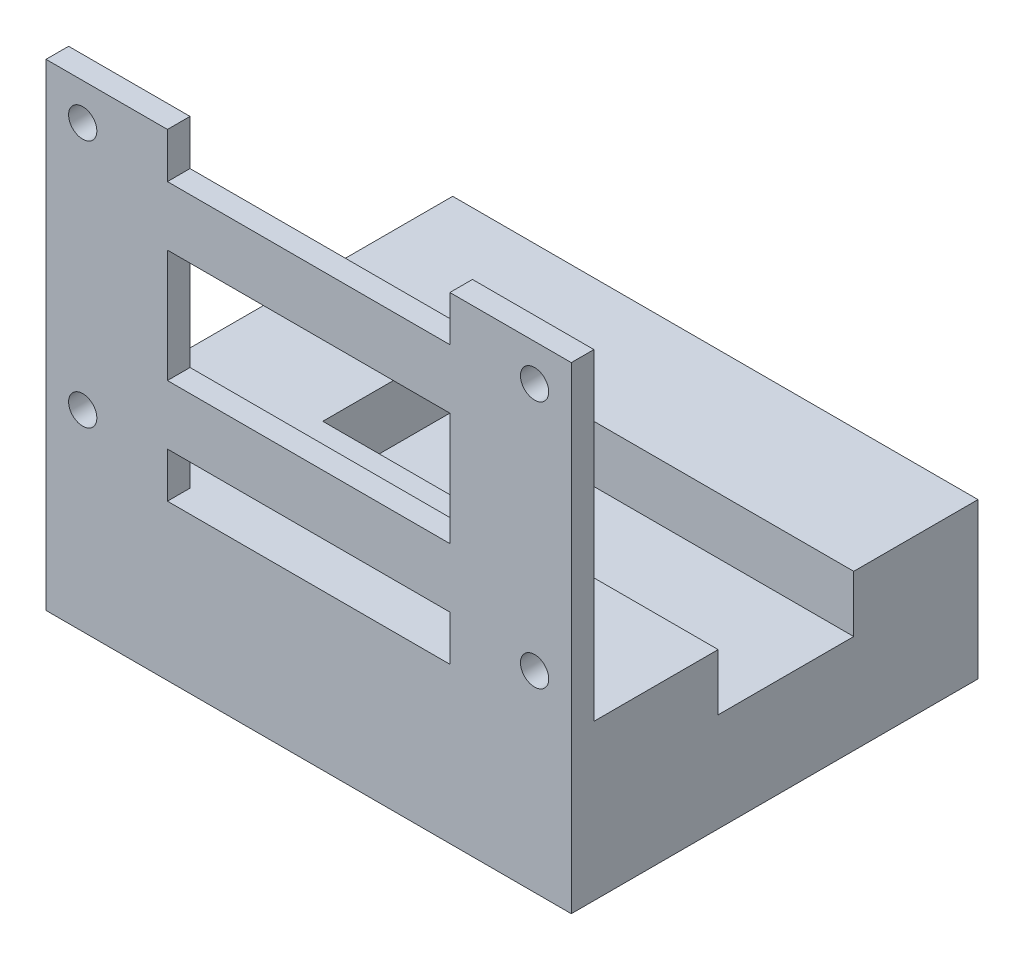
ISO-10303-21;
HEADER;
FILE_DESCRIPTION(('STEP AP214'),'2;1');
FILE_NAME('part.step','',(''),(''),'','','');
FILE_SCHEMA(('AUTOMOTIVE_DESIGN { 1 0 10303 214 1 1 1 1 }'));
ENDSEC;
DATA;
#1=APPLICATION_CONTEXT('core data for automotive mechanical design processes');
#2=APPLICATION_PROTOCOL_DEFINITION('international standard','automotive_design',2000,#1);
#3=PRODUCT_CONTEXT('',#1,'mechanical');
#4=PRODUCT('Part','Part','',(#3));
#5=PRODUCT_RELATED_PRODUCT_CATEGORY('part','',(#4));
#6=PRODUCT_DEFINITION_FORMATION('','',#4);
#7=PRODUCT_DEFINITION_CONTEXT('part definition',#1,'design');
#8=PRODUCT_DEFINITION('design','',#6,#7);
#9=PRODUCT_DEFINITION_SHAPE('','',#8);
#10=(LENGTH_UNIT() NAMED_UNIT(*) SI_UNIT(.MILLI.,.METRE.));
#11=(NAMED_UNIT(*) PLANE_ANGLE_UNIT() SI_UNIT($,.RADIAN.));
#12=(NAMED_UNIT(*) SI_UNIT($,.STERADIAN.) SOLID_ANGLE_UNIT());
#13=UNCERTAINTY_MEASURE_WITH_UNIT(LENGTH_MEASURE(1.E-05),#10,'distance_accuracy_value','');
#14=(GEOMETRIC_REPRESENTATION_CONTEXT(3) GLOBAL_UNCERTAINTY_ASSIGNED_CONTEXT((#13)) GLOBAL_UNIT_ASSIGNED_CONTEXT((#10,
#11,#12)) REPRESENTATION_CONTEXT('',''));
#15=CARTESIAN_POINT('',(0.,0.,0.));
#16=DIRECTION('',(0.,0.,1.));
#17=DIRECTION('',(1.,0.,0.));
#18=AXIS2_PLACEMENT_3D('',#15,#16,#17);
#19=CARTESIAN_POINT('',(-23.25,42.25,19.));
#20=DIRECTION('',(0.,-1.,0.));
#21=DIRECTION('',(0.,0.,-1.));
#22=AXIS2_PLACEMENT_3D('',#19,#20,#21);
#23=PLANE('',#22);
#24=DIRECTION('',(-1.,0.,0.));
#25=VECTOR('',#24,1.);
#26=CARTESIAN_POINT('',(-23.25,42.25,17.));
#27=LINE('',#26,#25);
#28=CARTESIAN_POINT('',(23.25,42.25,17.));
#29=VERTEX_POINT('',#28);
#30=CARTESIAN_POINT('',(12.5,42.25,17.));
#31=VERTEX_POINT('',#30);
#32=EDGE_CURVE('E454',#29,#31,#27,.T.);
#33=ORIENTED_EDGE('',*,*,#32,.T.);
#34=DIRECTION('',(0.,0.,-1.));
#35=VECTOR('',#34,1.);
#36=CARTESIAN_POINT('',(12.5,42.25,27.));
#37=LINE('',#36,#35);
#38=CARTESIAN_POINT('',(12.5,42.25,19.));
#39=VERTEX_POINT('',#38);
#40=EDGE_CURVE('E289',#39,#31,#37,.T.);
#41=ORIENTED_EDGE('',*,*,#40,.F.);
#42=DIRECTION('',(-1.,0.,0.));
#43=VECTOR('',#42,1.);
#44=CARTESIAN_POINT('',(-23.25,42.25,19.));
#45=LINE('',#44,#43);
#46=CARTESIAN_POINT('',(23.25,42.25,19.));
#47=VERTEX_POINT('',#46);
#48=EDGE_CURVE('E462',#47,#39,#45,.T.);
#49=ORIENTED_EDGE('',*,*,#48,.F.);
#50=DIRECTION('',(0.,0.,-1.));
#51=VECTOR('',#50,1.);
#52=CARTESIAN_POINT('',(23.25,42.25,19.));
#53=LINE('',#52,#51);
#54=EDGE_CURVE('E233',#47,#29,#53,.T.);
#55=ORIENTED_EDGE('',*,*,#54,.T.);
#56=EDGE_LOOP('',(#33,#41,#49,#55));
#57=FACE_BOUND('',#56,.T.);
#58=ADVANCED_FACE('F39',(#57),#23,.F.);
#59=CARTESIAN_POINT('',(23.25,13.75,17.));
#60=DIRECTION('',(-1.,0.,0.));
#61=DIRECTION('',(0.,0.,1.));
#62=AXIS2_PLACEMENT_3D('',#59,#60,#61);
#63=PLANE('',#62);
#64=DIRECTION('',(0.,0.,-1.));
#65=VECTOR('',#64,1.);
#66=CARTESIAN_POINT('',(23.25,8.75,-6.));
#67=LINE('',#66,#65);
#68=CARTESIAN_POINT('',(23.25,8.75,6.));
#69=VERTEX_POINT('',#68);
#70=CARTESIAN_POINT('',(23.25,8.75,-6.));
#71=VERTEX_POINT('',#70);
#72=EDGE_CURVE('E333',#69,#71,#67,.T.);
#73=ORIENTED_EDGE('',*,*,#72,.F.);
#74=DIRECTION('',(0.,1.,0.));
#75=VECTOR('',#74,1.);
#76=CARTESIAN_POINT('',(23.25,8.75,6.));
#77=LINE('',#76,#75);
#78=CARTESIAN_POINT('',(23.25,13.75,6.));
#79=VERTEX_POINT('',#78);
#80=EDGE_CURVE('E360',#69,#79,#77,.T.);
#81=ORIENTED_EDGE('',*,*,#80,.T.);
#82=DIRECTION('',(0.,0.,-1.));
#83=VECTOR('',#82,1.);
#84=CARTESIAN_POINT('',(23.25,13.75,17.));
#85=LINE('',#84,#83);
#86=CARTESIAN_POINT('',(23.25,13.75,17.));
#87=VERTEX_POINT('',#86);
#88=EDGE_CURVE('E482',#87,#79,#85,.T.);
#89=ORIENTED_EDGE('',*,*,#88,.F.);
#90=DIRECTION('',(0.,1.,0.));
#91=VECTOR('',#90,1.);
#92=CARTESIAN_POINT('',(23.25,0.,17.));
#93=LINE('',#92,#91);
#94=EDGE_CURVE('E469',#87,#29,#93,.T.);
#95=ORIENTED_EDGE('',*,*,#94,.T.);
#96=ORIENTED_EDGE('',*,*,#54,.F.);
#97=DIRECTION('',(0.,1.,0.));
#98=VECTOR('',#97,1.);
#99=CARTESIAN_POINT('',(23.25,0.,19.));
#100=LINE('',#99,#98);
#101=CARTESIAN_POINT('',(23.25,0.,19.));
#102=VERTEX_POINT('',#101);
#103=EDGE_CURVE('E458',#102,#47,#100,.T.);
#104=ORIENTED_EDGE('',*,*,#103,.F.);
#105=DIRECTION('',(0.,0.,-1.));
#106=VECTOR('',#105,1.);
#107=CARTESIAN_POINT('',(23.25,0.,17.));
#108=LINE('',#107,#106);
#109=CARTESIAN_POINT('',(23.25,0.,-17.));
#110=VERTEX_POINT('',#109);
#111=EDGE_CURVE('E228',#102,#110,#108,.T.);
#112=ORIENTED_EDGE('',*,*,#111,.T.);
#113=DIRECTION('',(0.,-1.,0.));
#114=VECTOR('',#113,1.);
#115=CARTESIAN_POINT('',(23.25,13.75,-17.));
#116=LINE('',#115,#114);
#117=CARTESIAN_POINT('',(23.25,13.75,-17.));
#118=VERTEX_POINT('',#117);
#119=EDGE_CURVE('E223',#118,#110,#116,.T.);
#120=ORIENTED_EDGE('',*,*,#119,.F.);
#121=CARTESIAN_POINT('',(23.25,13.75,-6.));
#122=VERTEX_POINT('',#121);
#123=EDGE_CURVE('E238',#122,#118,#85,.T.);
#124=ORIENTED_EDGE('',*,*,#123,.F.);
#125=DIRECTION('',(0.,1.,0.));
#126=VECTOR('',#125,1.);
#127=CARTESIAN_POINT('',(23.25,8.75,-6.));
#128=LINE('',#127,#126);
#129=EDGE_CURVE('E350',#71,#122,#128,.T.);
#130=ORIENTED_EDGE('',*,*,#129,.F.);
#131=EDGE_LOOP('',(#73,#81,#89,#95,#96,#104,#112,#120,#124,#130));
#132=FACE_BOUND('',#131,.T.);
#133=ADVANCED_FACE('F41',(#132),#63,.F.);
#134=CARTESIAN_POINT('',(-23.25,13.75,-17.));
#135=DIRECTION('',(0.,0.,1.));
#136=DIRECTION('',(1.,0.,0.));
#137=AXIS2_PLACEMENT_3D('',#134,#135,#136);
#138=PLANE('',#137);
#139=DIRECTION('',(-1.,0.,0.));
#140=VECTOR('',#139,1.);
#141=CARTESIAN_POINT('',(-23.25,0.,-17.));
#142=LINE('',#141,#140);
#143=CARTESIAN_POINT('',(-23.25,0.,-17.));
#144=VERTEX_POINT('',#143);
#145=EDGE_CURVE('E232',#110,#144,#142,.T.);
#146=ORIENTED_EDGE('',*,*,#145,.T.);
#147=DIRECTION('',(0.,-1.,0.));
#148=VECTOR('',#147,1.);
#149=CARTESIAN_POINT('',(-23.25,13.75,-17.));
#150=LINE('',#149,#148);
#151=CARTESIAN_POINT('',(-23.25,13.75,-17.));
#152=VERTEX_POINT('',#151);
#153=EDGE_CURVE('E217',#152,#144,#150,.T.);
#154=ORIENTED_EDGE('',*,*,#153,.F.);
#155=DIRECTION('',(-1.,0.,0.));
#156=VECTOR('',#155,1.);
#157=CARTESIAN_POINT('',(-23.25,13.75,-17.));
#158=LINE('',#157,#156);
#159=EDGE_CURVE('E484',#118,#152,#158,.T.);
#160=ORIENTED_EDGE('',*,*,#159,.F.);
#161=ORIENTED_EDGE('',*,*,#119,.T.);
#162=EDGE_LOOP('',(#146,#154,#160,#161));
#163=FACE_BOUND('',#162,.T.);
#164=ADVANCED_FACE('F493',(#163),#138,.F.);
#165=CARTESIAN_POINT('',(-23.25,13.75,17.));
#166=DIRECTION('',(1.,0.,0.));
#167=DIRECTION('',(0.,0.,-1.));
#168=AXIS2_PLACEMENT_3D('',#165,#166,#167);
#169=PLANE('',#168);
#170=DIRECTION('',(0.,0.,1.));
#171=VECTOR('',#170,1.);
#172=CARTESIAN_POINT('',(-23.25,0.,17.));
#173=LINE('',#172,#171);
#174=CARTESIAN_POINT('',(-23.25,0.,19.));
#175=VERTEX_POINT('',#174);
#176=EDGE_CURVE('E236',#144,#175,#173,.T.);
#177=ORIENTED_EDGE('',*,*,#176,.T.);
#178=DIRECTION('',(0.,-1.,0.));
#179=VECTOR('',#178,1.);
#180=CARTESIAN_POINT('',(-23.25,0.,19.));
#181=LINE('',#180,#179);
#182=CARTESIAN_POINT('',(-23.25,42.25,19.));
#183=VERTEX_POINT('',#182);
#184=EDGE_CURVE('E449',#183,#175,#181,.T.);
#185=ORIENTED_EDGE('',*,*,#184,.F.);
#186=DIRECTION('',(0.,0.,-1.));
#187=VECTOR('',#186,1.);
#188=CARTESIAN_POINT('',(-23.25,42.25,19.));
#189=LINE('',#188,#187);
#190=CARTESIAN_POINT('',(-23.25,42.25,17.));
#191=VERTEX_POINT('',#190);
#192=EDGE_CURVE('E466',#183,#191,#189,.T.);
#193=ORIENTED_EDGE('',*,*,#192,.T.);
#194=DIRECTION('',(0.,-1.,0.));
#195=VECTOR('',#194,1.);
#196=CARTESIAN_POINT('',(-23.25,0.,17.));
#197=LINE('',#196,#195);
#198=CARTESIAN_POINT('',(-23.25,13.75,17.));
#199=VERTEX_POINT('',#198);
#200=EDGE_CURVE('E445',#191,#199,#197,.T.);
#201=ORIENTED_EDGE('',*,*,#200,.T.);
#202=DIRECTION('',(0.,0.,1.));
#203=VECTOR('',#202,1.);
#204=CARTESIAN_POINT('',(-23.25,13.75,17.));
#205=LINE('',#204,#203);
#206=EDGE_CURVE('E215',#152,#199,#205,.T.);
#207=ORIENTED_EDGE('',*,*,#206,.F.);
#208=ORIENTED_EDGE('',*,*,#153,.T.);
#209=EDGE_LOOP('',(#177,#185,#193,#201,#207,#208));
#210=FACE_BOUND('',#209,.T.);
#211=ADVANCED_FACE('F496',(#210),#169,.F.);
#212=CARTESIAN_POINT('',(0.,13.75,0.));
#213=DIRECTION('',(0.,-1.,0.));
#214=DIRECTION('',(0.,0.,-1.));
#215=AXIS2_PLACEMENT_3D('',#212,#213,#214);
#216=PLANE('',#215);
#217=ORIENTED_EDGE('',*,*,#88,.T.);
#218=DIRECTION('',(1.,0.,0.));
#219=VECTOR('',#218,1.);
#220=CARTESIAN_POINT('',(23.25,13.75,6.));
#221=LINE('',#220,#219);
#222=CARTESIAN_POINT('',(-11.75,13.75,6.00000000000001));
#223=VERTEX_POINT('',#222);
#224=EDGE_CURVE('E338',#223,#79,#221,.T.);
#225=ORIENTED_EDGE('',*,*,#224,.F.);
#226=DIRECTION('',(0.,0.,1.));
#227=VECTOR('',#226,1.);
#228=CARTESIAN_POINT('',(-11.75,13.75,-5.99999999999999));
#229=LINE('',#228,#227);
#230=CARTESIAN_POINT('',(-11.75,13.75,-5.99999999999999));
#231=VERTEX_POINT('',#230);
#232=EDGE_CURVE('E354',#231,#223,#229,.T.);
#233=ORIENTED_EDGE('',*,*,#232,.F.);
#234=DIRECTION('',(-1.,0.,0.));
#235=VECTOR('',#234,1.);
#236=CARTESIAN_POINT('',(23.25,13.75,-6.));
#237=LINE('',#236,#235);
#238=EDGE_CURVE('E329',#122,#231,#237,.T.);
#239=ORIENTED_EDGE('',*,*,#238,.F.);
#240=ORIENTED_EDGE('',*,*,#123,.T.);
#241=ORIENTED_EDGE('',*,*,#159,.T.);
#242=ORIENTED_EDGE('',*,*,#206,.T.);
#243=DIRECTION('',(1.,0.,0.));
#244=VECTOR('',#243,1.);
#245=CARTESIAN_POINT('',(-23.25,13.75,17.));
#246=LINE('',#245,#244);
#247=CARTESIAN_POINT('',(-12.5,13.75,17.));
#248=VERTEX_POINT('',#247);
#249=EDGE_CURVE('E205',#199,#248,#246,.T.);
#250=ORIENTED_EDGE('',*,*,#249,.T.);
#251=DIRECTION('',(0.,0.,-1.));
#252=VECTOR('',#251,1.);
#253=CARTESIAN_POINT('',(-12.5,13.75,27.));
#254=LINE('',#253,#252);
#255=CARTESIAN_POINT('',(-12.5,13.75,19.));
#256=VERTEX_POINT('',#255);
#257=EDGE_CURVE('E63',#256,#248,#254,.T.);
#258=ORIENTED_EDGE('',*,*,#257,.F.);
#259=DIRECTION('',(-1.,0.,0.));
#260=VECTOR('',#259,1.);
#261=CARTESIAN_POINT('',(0.,13.75,19.));
#262=LINE('',#261,#260);
#263=CARTESIAN_POINT('',(12.5,13.75,19.));
#264=VERTEX_POINT('',#263);
#265=EDGE_CURVE('E255',#264,#256,#262,.T.);
#266=ORIENTED_EDGE('',*,*,#265,.F.);
#267=DIRECTION('',(0.,0.,-1.));
#268=VECTOR('',#267,1.);
#269=CARTESIAN_POINT('',(12.5,13.75,27.));
#270=LINE('',#269,#268);
#271=CARTESIAN_POINT('',(12.5,13.75,17.));
#272=VERTEX_POINT('',#271);
#273=EDGE_CURVE('E199',#264,#272,#270,.T.);
#274=ORIENTED_EDGE('',*,*,#273,.T.);
#275=EDGE_CURVE('E218',#272,#87,#246,.T.);
#276=ORIENTED_EDGE('',*,*,#275,.T.);
#277=EDGE_LOOP('',(#217,#225,#233,#239,#240,#241,#242,#250,#258,#266,#274,#276));
#278=FACE_BOUND('',#277,.T.);
#279=ADVANCED_FACE('F213',(#278),#216,.F.);
#280=CARTESIAN_POINT('',(0.,0.,0.));
#281=DIRECTION('',(0.,-1.,0.));
#282=DIRECTION('',(0.,0.,-1.));
#283=AXIS2_PLACEMENT_3D('',#280,#281,#282);
#284=PLANE('',#283);
#285=CARTESIAN_POINT('',(16.25,0.,12.));
#286=DIRECTION('',(0.,-1.,0.));
#287=DIRECTION('',(0.,0.,-1.));
#288=AXIS2_PLACEMENT_3D('',#285,#286,#287);
#289=CIRCLE('',#288,2.);
#290=CARTESIAN_POINT('',(16.25,0.,10.));
#291=VERTEX_POINT('',#290);
#292=EDGE_CURVE('E309',#291,#291,#289,.T.);
#293=ORIENTED_EDGE('',*,*,#292,.F.);
#294=EDGE_LOOP('',(#293));
#295=FACE_BOUND('',#294,.T.);
#296=CARTESIAN_POINT('',(-16.25,0.,-10.));
#297=DIRECTION('',(0.,-1.,0.));
#298=DIRECTION('',(0.,0.,-1.));
#299=AXIS2_PLACEMENT_3D('',#296,#297,#298);
#300=CIRCLE('',#299,2.);
#301=CARTESIAN_POINT('',(-16.25,0.,-12.));
#302=VERTEX_POINT('',#301);
#303=EDGE_CURVE('E318',#302,#302,#300,.T.);
#304=ORIENTED_EDGE('',*,*,#303,.F.);
#305=EDGE_LOOP('',(#304));
#306=FACE_BOUND('',#305,.T.);
#307=CARTESIAN_POINT('',(-16.25,0.,12.));
#308=DIRECTION('',(0.,-1.,0.));
#309=DIRECTION('',(0.,0.,-1.));
#310=AXIS2_PLACEMENT_3D('',#307,#308,#309);
#311=CIRCLE('',#310,2.);
#312=CARTESIAN_POINT('',(-16.25,0.,10.));
#313=VERTEX_POINT('',#312);
#314=EDGE_CURVE('E301',#313,#313,#311,.T.);
#315=ORIENTED_EDGE('',*,*,#314,.F.);
#316=EDGE_LOOP('',(#315));
#317=FACE_BOUND('',#316,.T.);
#318=CARTESIAN_POINT('',(16.25,0.,-10.));
#319=DIRECTION('',(0.,-1.,0.));
#320=DIRECTION('',(0.,0.,-1.));
#321=AXIS2_PLACEMENT_3D('',#318,#319,#320);
#322=CIRCLE('',#321,2.);
#323=CARTESIAN_POINT('',(16.25,0.,-12.));
#324=VERTEX_POINT('',#323);
#325=EDGE_CURVE('E313',#324,#324,#322,.T.);
#326=ORIENTED_EDGE('',*,*,#325,.F.);
#327=EDGE_LOOP('',(#326));
#328=FACE_BOUND('',#327,.T.);
#329=ORIENTED_EDGE('',*,*,#111,.F.);
#330=DIRECTION('',(1.,0.,0.));
#331=VECTOR('',#330,1.);
#332=CARTESIAN_POINT('',(-23.25,0.,19.));
#333=LINE('',#332,#331);
#334=EDGE_CURVE('E453',#175,#102,#333,.T.);
#335=ORIENTED_EDGE('',*,*,#334,.F.);
#336=ORIENTED_EDGE('',*,*,#176,.F.);
#337=ORIENTED_EDGE('',*,*,#145,.F.);
#338=EDGE_LOOP('',(#329,#335,#336,#337));
#339=FACE_BOUND('',#338,.T.);
#340=ADVANCED_FACE('F512',(#295,#306,#317,#328,#339),#284,.T.);
#341=CARTESIAN_POINT('',(0.,0.,17.));
#342=DIRECTION('',(0.,0.,-1.));
#343=DIRECTION('',(-1.,0.,0.));
#344=AXIS2_PLACEMENT_3D('',#341,#342,#343);
#345=PLANE('',#344);
#346=DIRECTION('',(0.,-1.,0.));
#347=VECTOR('',#346,1.);
#348=CARTESIAN_POINT('',(12.5,13.75,17.));
#349=LINE('',#348,#347);
#350=CARTESIAN_POINT('',(12.5,17.75,17.));
#351=VERTEX_POINT('',#350);
#352=EDGE_CURVE('E55',#351,#272,#349,.T.);
#353=ORIENTED_EDGE('',*,*,#352,.F.);
#354=DIRECTION('',(1.,0.,0.));
#355=VECTOR('',#354,1.);
#356=CARTESIAN_POINT('',(12.5,17.75,17.));
#357=LINE('',#356,#355);
#358=CARTESIAN_POINT('',(-12.5,17.75,17.));
#359=VERTEX_POINT('',#358);
#360=EDGE_CURVE('E208',#359,#351,#357,.T.);
#361=ORIENTED_EDGE('',*,*,#360,.F.);
#362=DIRECTION('',(0.,1.,0.));
#363=VECTOR('',#362,1.);
#364=CARTESIAN_POINT('',(-12.5,13.75,17.));
#365=LINE('',#364,#363);
#366=EDGE_CURVE('E192',#248,#359,#365,.T.);
#367=ORIENTED_EDGE('',*,*,#366,.F.);
#368=ORIENTED_EDGE('',*,*,#249,.F.);
#369=ORIENTED_EDGE('',*,*,#200,.F.);
#370=CARTESIAN_POINT('',(-12.5,42.25,17.));
#371=VERTEX_POINT('',#370);
#372=EDGE_CURVE('E472',#371,#191,#27,.T.);
#373=ORIENTED_EDGE('',*,*,#372,.F.);
#374=DIRECTION('',(0.,1.,0.));
#375=VECTOR('',#374,1.);
#376=CARTESIAN_POINT('',(-12.5,42.25,17.));
#377=LINE('',#376,#375);
#378=CARTESIAN_POINT('',(-12.5,38.25,17.));
#379=VERTEX_POINT('',#378);
#380=EDGE_CURVE('E285',#379,#371,#377,.T.);
#381=ORIENTED_EDGE('',*,*,#380,.F.);
#382=DIRECTION('',(-1.,0.,0.));
#383=VECTOR('',#382,1.);
#384=CARTESIAN_POINT('',(12.5,38.25,17.));
#385=LINE('',#384,#383);
#386=CARTESIAN_POINT('',(12.5,38.25,17.));
#387=VERTEX_POINT('',#386);
#388=EDGE_CURVE('E281',#387,#379,#385,.T.);
#389=ORIENTED_EDGE('',*,*,#388,.F.);
#390=DIRECTION('',(0.,-1.,0.));
#391=VECTOR('',#390,1.);
#392=CARTESIAN_POINT('',(12.5,42.25,17.));
#393=LINE('',#392,#391);
#394=EDGE_CURVE('E277',#31,#387,#393,.T.);
#395=ORIENTED_EDGE('',*,*,#394,.F.);
#396=ORIENTED_EDGE('',*,*,#32,.F.);
#397=ORIENTED_EDGE('',*,*,#94,.F.);
#398=ORIENTED_EDGE('',*,*,#275,.F.);
#399=EDGE_LOOP('',(#353,#361,#367,#368,#369,#373,#381,#389,#395,#396,#397,#398));
#400=FACE_BOUND('',#399,.T.);
#401=DIRECTION('',(0.,-1.,0.));
#402=VECTOR('',#401,1.);
#403=CARTESIAN_POINT('',(-12.5,33.,17.));
#404=LINE('',#403,#402);
#405=CARTESIAN_POINT('',(-12.5,33.,17.));
#406=VERTEX_POINT('',#405);
#407=CARTESIAN_POINT('',(-12.5,23.,17.));
#408=VERTEX_POINT('',#407);
#409=EDGE_CURVE('E406',#406,#408,#404,.T.);
#410=ORIENTED_EDGE('',*,*,#409,.T.);
#411=DIRECTION('',(1.,0.,0.));
#412=VECTOR('',#411,1.);
#413=CARTESIAN_POINT('',(-12.5,23.,17.));
#414=LINE('',#413,#412);
#415=CARTESIAN_POINT('',(12.5,23.,17.));
#416=VERTEX_POINT('',#415);
#417=EDGE_CURVE('E398',#408,#416,#414,.T.);
#418=ORIENTED_EDGE('',*,*,#417,.T.);
#419=DIRECTION('',(0.,1.,0.));
#420=VECTOR('',#419,1.);
#421=CARTESIAN_POINT('',(12.5,33.,17.));
#422=LINE('',#421,#420);
#423=CARTESIAN_POINT('',(12.5,33.,17.));
#424=VERTEX_POINT('',#423);
#425=EDGE_CURVE('E364',#416,#424,#422,.T.);
#426=ORIENTED_EDGE('',*,*,#425,.T.);
#427=DIRECTION('',(-1.,0.,0.));
#428=VECTOR('',#427,1.);
#429=CARTESIAN_POINT('',(-12.5,33.,17.));
#430=LINE('',#429,#428);
#431=EDGE_CURVE('E402',#424,#406,#430,.T.);
#432=ORIENTED_EDGE('',*,*,#431,.T.);
#433=EDGE_LOOP('',(#410,#418,#426,#432));
#434=FACE_BOUND('',#433,.T.);
#435=CARTESIAN_POINT('',(-20.,17.,17.));
#436=DIRECTION('',(0.,0.,-1.));
#437=DIRECTION('',(-1.,0.,0.));
#438=AXIS2_PLACEMENT_3D('',#435,#436,#437);
#439=CIRCLE('',#438,1.25);
#440=CARTESIAN_POINT('',(-21.25,17.,17.));
#441=VERTEX_POINT('',#440);
#442=EDGE_CURVE('E394',#441,#441,#439,.F.);
#443=ORIENTED_EDGE('',*,*,#442,.T.);
#444=EDGE_LOOP('',(#443));
#445=FACE_BOUND('',#444,.T.);
#446=CARTESIAN_POINT('',(20.,39.,17.));
#447=DIRECTION('',(0.,0.,-1.));
#448=DIRECTION('',(-1.,0.,0.));
#449=AXIS2_PLACEMENT_3D('',#446,#447,#448);
#450=CIRCLE('',#449,1.25);
#451=CARTESIAN_POINT('',(18.75,39.,17.));
#452=VERTEX_POINT('',#451);
#453=EDGE_CURVE('E386',#452,#452,#450,.F.);
#454=ORIENTED_EDGE('',*,*,#453,.T.);
#455=EDGE_LOOP('',(#454));
#456=FACE_BOUND('',#455,.T.);
#457=CARTESIAN_POINT('',(20.,17.,17.));
#458=DIRECTION('',(0.,0.,-1.));
#459=DIRECTION('',(-1.,0.,0.));
#460=AXIS2_PLACEMENT_3D('',#457,#458,#459);
#461=CIRCLE('',#460,1.25);
#462=CARTESIAN_POINT('',(18.75,17.,17.));
#463=VERTEX_POINT('',#462);
#464=EDGE_CURVE('E378',#463,#463,#461,.F.);
#465=ORIENTED_EDGE('',*,*,#464,.T.);
#466=EDGE_LOOP('',(#465));
#467=FACE_BOUND('',#466,.T.);
#468=CARTESIAN_POINT('',(-20.,39.,17.));
#469=DIRECTION('',(0.,0.,-1.));
#470=DIRECTION('',(-1.,0.,0.));
#471=AXIS2_PLACEMENT_3D('',#468,#469,#470);
#472=CIRCLE('',#471,1.25);
#473=CARTESIAN_POINT('',(-21.25,39.,17.));
#474=VERTEX_POINT('',#473);
#475=EDGE_CURVE('E377',#474,#474,#472,.F.);
#476=ORIENTED_EDGE('',*,*,#475,.T.);
#477=EDGE_LOOP('',(#476));
#478=FACE_BOUND('',#477,.T.);
#479=ADVANCED_FACE('F202',(#400,#434,#445,#456,#467,#478),#345,.T.);
#480=CARTESIAN_POINT('',(-12.5,42.25,19.));
#481=VERTEX_POINT('',#480);
#482=EDGE_CURVE('E461',#481,#183,#45,.T.);
#483=ORIENTED_EDGE('',*,*,#482,.F.);
#484=DIRECTION('',(0.,0.,-1.));
#485=VECTOR('',#484,1.);
#486=CARTESIAN_POINT('',(-12.5,42.25,27.));
#487=LINE('',#486,#485);
#488=EDGE_CURVE('E292',#481,#371,#487,.T.);
#489=ORIENTED_EDGE('',*,*,#488,.T.);
#490=ORIENTED_EDGE('',*,*,#372,.T.);
#491=ORIENTED_EDGE('',*,*,#192,.F.);
#492=EDGE_LOOP('',(#483,#489,#490,#491));
#493=FACE_BOUND('',#492,.T.);
#494=ADVANCED_FACE('F509',(#493),#23,.F.);
#495=CARTESIAN_POINT('',(0.,0.,19.));
#496=DIRECTION('',(0.,0.,-1.));
#497=DIRECTION('',(-1.,0.,0.));
#498=AXIS2_PLACEMENT_3D('',#495,#496,#497);
#499=PLANE('',#498);
#500=DIRECTION('',(1.,0.,0.));
#501=VECTOR('',#500,1.);
#502=CARTESIAN_POINT('',(0.,17.75,19.));
#503=LINE('',#502,#501);
#504=CARTESIAN_POINT('',(-12.5,17.75,19.));
#505=VERTEX_POINT('',#504);
#506=CARTESIAN_POINT('',(12.5,17.75,19.));
#507=VERTEX_POINT('',#506);
#508=EDGE_CURVE('E48',#505,#507,#503,.T.);
#509=ORIENTED_EDGE('',*,*,#508,.T.);
#510=DIRECTION('',(0.,-1.,0.));
#511=VECTOR('',#510,1.);
#512=CARTESIAN_POINT('',(12.5,0.,19.));
#513=LINE('',#512,#511);
#514=EDGE_CURVE('E11',#507,#264,#513,.T.);
#515=ORIENTED_EDGE('',*,*,#514,.T.);
#516=ORIENTED_EDGE('',*,*,#265,.T.);
#517=DIRECTION('',(0.,1.,0.));
#518=VECTOR('',#517,1.);
#519=CARTESIAN_POINT('',(-12.5,0.,19.));
#520=LINE('',#519,#518);
#521=EDGE_CURVE('E195',#256,#505,#520,.T.);
#522=ORIENTED_EDGE('',*,*,#521,.T.);
#523=EDGE_LOOP('',(#509,#515,#516,#522));
#524=FACE_BOUND('',#523,.T.);
#525=ORIENTED_EDGE('',*,*,#48,.T.);
#526=DIRECTION('',(0.,-1.,0.));
#527=VECTOR('',#526,1.);
#528=CARTESIAN_POINT('',(12.5,0.,19.));
#529=LINE('',#528,#527);
#530=CARTESIAN_POINT('',(12.5,38.25,19.));
#531=VERTEX_POINT('',#530);
#532=EDGE_CURVE('E251',#39,#531,#529,.T.);
#533=ORIENTED_EDGE('',*,*,#532,.T.);
#534=DIRECTION('',(-1.,0.,0.));
#535=VECTOR('',#534,1.);
#536=CARTESIAN_POINT('',(0.,38.25,19.));
#537=LINE('',#536,#535);
#538=CARTESIAN_POINT('',(-12.5,38.25,19.));
#539=VERTEX_POINT('',#538);
#540=EDGE_CURVE('E243',#531,#539,#537,.T.);
#541=ORIENTED_EDGE('',*,*,#540,.T.);
#542=DIRECTION('',(0.,1.,0.));
#543=VECTOR('',#542,1.);
#544=CARTESIAN_POINT('',(-12.5,0.,19.));
#545=LINE('',#544,#543);
#546=EDGE_CURVE('E247',#539,#481,#545,.T.);
#547=ORIENTED_EDGE('',*,*,#546,.T.);
#548=ORIENTED_EDGE('',*,*,#482,.T.);
#549=ORIENTED_EDGE('',*,*,#184,.T.);
#550=ORIENTED_EDGE('',*,*,#334,.T.);
#551=ORIENTED_EDGE('',*,*,#103,.T.);
#552=EDGE_LOOP('',(#525,#533,#541,#547,#548,#549,#550,#551));
#553=FACE_BOUND('',#552,.T.);
#554=DIRECTION('',(1.,0.,0.));
#555=VECTOR('',#554,1.);
#556=CARTESIAN_POINT('',(-12.5,23.,19.));
#557=LINE('',#556,#555);
#558=CARTESIAN_POINT('',(-12.5,23.,19.));
#559=VERTEX_POINT('',#558);
#560=CARTESIAN_POINT('',(12.5,23.,19.));
#561=VERTEX_POINT('',#560);
#562=EDGE_CURVE('E413',#559,#561,#557,.T.);
#563=ORIENTED_EDGE('',*,*,#562,.F.);
#564=DIRECTION('',(0.,-1.,0.));
#565=VECTOR('',#564,1.);
#566=CARTESIAN_POINT('',(-12.5,33.,19.));
#567=LINE('',#566,#565);
#568=CARTESIAN_POINT('',(-12.5,33.,19.));
#569=VERTEX_POINT('',#568);
#570=EDGE_CURVE('E410',#569,#559,#567,.T.);
#571=ORIENTED_EDGE('',*,*,#570,.F.);
#572=DIRECTION('',(-1.,0.,0.));
#573=VECTOR('',#572,1.);
#574=CARTESIAN_POINT('',(-12.5,33.,19.));
#575=LINE('',#574,#573);
#576=CARTESIAN_POINT('',(12.5,33.,19.));
#577=VERTEX_POINT('',#576);
#578=EDGE_CURVE('E421',#577,#569,#575,.T.);
#579=ORIENTED_EDGE('',*,*,#578,.F.);
#580=DIRECTION('',(0.,1.,0.));
#581=VECTOR('',#580,1.);
#582=CARTESIAN_POINT('',(12.5,33.,19.));
#583=LINE('',#582,#581);
#584=EDGE_CURVE('E417',#561,#577,#583,.T.);
#585=ORIENTED_EDGE('',*,*,#584,.F.);
#586=EDGE_LOOP('',(#563,#571,#579,#585));
#587=FACE_BOUND('',#586,.T.);
#588=CARTESIAN_POINT('',(-20.,17.,19.));
#589=DIRECTION('',(0.,0.,1.));
#590=DIRECTION('',(-1.,0.,0.));
#591=AXIS2_PLACEMENT_3D('',#588,#589,#590);
#592=CIRCLE('',#591,1.25);
#593=CARTESIAN_POINT('',(-21.25,17.,19.));
#594=VERTEX_POINT('',#593);
#595=EDGE_CURVE('E390',#594,#594,#592,.T.);
#596=ORIENTED_EDGE('',*,*,#595,.F.);
#597=EDGE_LOOP('',(#596));
#598=FACE_BOUND('',#597,.T.);
#599=CARTESIAN_POINT('',(20.,39.,19.));
#600=DIRECTION('',(0.,0.,1.));
#601=DIRECTION('',(-1.,0.,0.));
#602=AXIS2_PLACEMENT_3D('',#599,#600,#601);
#603=CIRCLE('',#602,1.25);
#604=CARTESIAN_POINT('',(18.75,39.,19.));
#605=VERTEX_POINT('',#604);
#606=EDGE_CURVE('E382',#605,#605,#603,.T.);
#607=ORIENTED_EDGE('',*,*,#606,.F.);
#608=EDGE_LOOP('',(#607));
#609=FACE_BOUND('',#608,.T.);
#610=CARTESIAN_POINT('',(20.,17.,19.));
#611=DIRECTION('',(0.,0.,1.));
#612=DIRECTION('',(1.,0.,0.));
#613=AXIS2_PLACEMENT_3D('',#610,#611,#612);
#614=CIRCLE('',#613,1.25);
#615=CARTESIAN_POINT('',(21.25,17.,19.));
#616=VERTEX_POINT('',#615);
#617=EDGE_CURVE('E373',#616,#616,#614,.T.);
#618=ORIENTED_EDGE('',*,*,#617,.F.);
#619=EDGE_LOOP('',(#618));
#620=FACE_BOUND('',#619,.T.);
#621=CARTESIAN_POINT('',(-20.,39.,19.));
#622=DIRECTION('',(0.,0.,1.));
#623=DIRECTION('',(1.,0.,0.));
#624=AXIS2_PLACEMENT_3D('',#621,#622,#623);
#625=CIRCLE('',#624,1.25);
#626=CARTESIAN_POINT('',(-18.75,39.,19.));
#627=VERTEX_POINT('',#626);
#628=EDGE_CURVE('E441',#627,#627,#625,.T.);
#629=ORIENTED_EDGE('',*,*,#628,.F.);
#630=EDGE_LOOP('',(#629));
#631=FACE_BOUND('',#630,.T.);
#632=ADVANCED_FACE('F262',(#524,#553,#587,#598,#609,#620,#631),#499,.F.);
#633=CARTESIAN_POINT('',(-20.,39.,-17.001));
#634=DIRECTION('',(0.,0.,1.));
#635=DIRECTION('',(1.,0.,0.));
#636=AXIS2_PLACEMENT_3D('',#633,#634,#635);
#637=CYLINDRICAL_SURFACE('',#636,1.25);
#638=ORIENTED_EDGE('',*,*,#475,.F.);
#639=EDGE_LOOP('',(#638));
#640=FACE_BOUND('',#639,.T.);
#641=ORIENTED_EDGE('',*,*,#628,.T.);
#642=EDGE_LOOP('',(#641));
#643=FACE_BOUND('',#642,.T.);
#644=ADVANCED_FACE('F556',(#640,#643),#637,.F.);
#645=CARTESIAN_POINT('',(20.,17.,-17.001));
#646=DIRECTION('',(0.,0.,1.));
#647=DIRECTION('',(1.,0.,0.));
#648=AXIS2_PLACEMENT_3D('',#645,#646,#647);
#649=CYLINDRICAL_SURFACE('',#648,1.25);
#650=ORIENTED_EDGE('',*,*,#464,.F.);
#651=EDGE_LOOP('',(#650));
#652=FACE_BOUND('',#651,.T.);
#653=ORIENTED_EDGE('',*,*,#617,.T.);
#654=EDGE_LOOP('',(#653));
#655=FACE_BOUND('',#654,.T.);
#656=ADVANCED_FACE('F566',(#652,#655),#649,.F.);
#657=CARTESIAN_POINT('',(20.,39.,-17.001));
#658=DIRECTION('',(0.,0.,1.));
#659=DIRECTION('',(1.,0.,0.));
#660=AXIS2_PLACEMENT_3D('',#657,#658,#659);
#661=CYLINDRICAL_SURFACE('',#660,1.25);
#662=ORIENTED_EDGE('',*,*,#453,.F.);
#663=EDGE_LOOP('',(#662));
#664=FACE_BOUND('',#663,.T.);
#665=ORIENTED_EDGE('',*,*,#606,.T.);
#666=EDGE_LOOP('',(#665));
#667=FACE_BOUND('',#666,.T.);
#668=ADVANCED_FACE('F588',(#664,#667),#661,.F.);
#669=CARTESIAN_POINT('',(-20.,17.,-17.001));
#670=DIRECTION('',(0.,0.,1.));
#671=DIRECTION('',(1.,0.,0.));
#672=AXIS2_PLACEMENT_3D('',#669,#670,#671);
#673=CYLINDRICAL_SURFACE('',#672,1.25);
#674=ORIENTED_EDGE('',*,*,#442,.F.);
#675=EDGE_LOOP('',(#674));
#676=FACE_BOUND('',#675,.T.);
#677=ORIENTED_EDGE('',*,*,#595,.T.);
#678=EDGE_LOOP('',(#677));
#679=FACE_BOUND('',#678,.T.);
#680=ADVANCED_FACE('F572',(#676,#679),#673,.F.);
#681=CARTESIAN_POINT('',(-12.5,33.,-17.001));
#682=DIRECTION('',(-1.,0.,0.));
#683=DIRECTION('',(0.,-1.,0.));
#684=AXIS2_PLACEMENT_3D('',#681,#682,#683);
#685=PLANE('',#684);
#686=DIRECTION('',(0.,0.,1.));
#687=VECTOR('',#686,1.);
#688=CARTESIAN_POINT('',(-12.5,33.,-17.001));
#689=LINE('',#688,#687);
#690=EDGE_CURVE('E426',#406,#569,#689,.T.);
#691=ORIENTED_EDGE('',*,*,#690,.T.);
#692=ORIENTED_EDGE('',*,*,#570,.T.);
#693=DIRECTION('',(0.,0.,1.));
#694=VECTOR('',#693,1.);
#695=CARTESIAN_POINT('',(-12.5,23.,-17.001));
#696=LINE('',#695,#694);
#697=EDGE_CURVE('E425',#408,#559,#696,.T.);
#698=ORIENTED_EDGE('',*,*,#697,.F.);
#699=ORIENTED_EDGE('',*,*,#409,.F.);
#700=EDGE_LOOP('',(#691,#692,#698,#699));
#701=FACE_BOUND('',#700,.T.);
#702=ADVANCED_FACE('F568',(#701),#685,.F.);
#703=CARTESIAN_POINT('',(-12.5,33.,-17.001));
#704=DIRECTION('',(0.,1.,0.));
#705=DIRECTION('',(0.,0.,1.));
#706=AXIS2_PLACEMENT_3D('',#703,#704,#705);
#707=PLANE('',#706);
#708=DIRECTION('',(0.,0.,1.));
#709=VECTOR('',#708,1.);
#710=CARTESIAN_POINT('',(12.5,33.,-17.001));
#711=LINE('',#710,#709);
#712=EDGE_CURVE('E429',#424,#577,#711,.T.);
#713=ORIENTED_EDGE('',*,*,#712,.T.);
#714=ORIENTED_EDGE('',*,*,#578,.T.);
#715=ORIENTED_EDGE('',*,*,#690,.F.);
#716=ORIENTED_EDGE('',*,*,#431,.F.);
#717=EDGE_LOOP('',(#713,#714,#715,#716));
#718=FACE_BOUND('',#717,.T.);
#719=ADVANCED_FACE('F571',(#718),#707,.F.);
#720=CARTESIAN_POINT('',(12.5,33.,-17.001));
#721=DIRECTION('',(1.,0.,0.));
#722=DIRECTION('',(0.,1.,0.));
#723=AXIS2_PLACEMENT_3D('',#720,#721,#722);
#724=PLANE('',#723);
#725=DIRECTION('',(0.,0.,1.));
#726=VECTOR('',#725,1.);
#727=CARTESIAN_POINT('',(12.5,23.,-17.001));
#728=LINE('',#727,#726);
#729=EDGE_CURVE('E432',#416,#561,#728,.T.);
#730=ORIENTED_EDGE('',*,*,#729,.T.);
#731=ORIENTED_EDGE('',*,*,#584,.T.);
#732=ORIENTED_EDGE('',*,*,#712,.F.);
#733=ORIENTED_EDGE('',*,*,#425,.F.);
#734=EDGE_LOOP('',(#730,#731,#732,#733));
#735=FACE_BOUND('',#734,.T.);
#736=ADVANCED_FACE('F578',(#735),#724,.F.);
#737=CARTESIAN_POINT('',(-12.5,23.,-17.001));
#738=DIRECTION('',(0.,-1.,0.));
#739=DIRECTION('',(0.,0.,-1.));
#740=AXIS2_PLACEMENT_3D('',#737,#738,#739);
#741=PLANE('',#740);
#742=ORIENTED_EDGE('',*,*,#697,.T.);
#743=ORIENTED_EDGE('',*,*,#562,.T.);
#744=ORIENTED_EDGE('',*,*,#729,.F.);
#745=ORIENTED_EDGE('',*,*,#417,.F.);
#746=EDGE_LOOP('',(#742,#743,#744,#745));
#747=FACE_BOUND('',#746,.T.);
#748=ADVANCED_FACE('F574',(#747),#741,.F.);
#749=CARTESIAN_POINT('',(23.25,8.75,6.));
#750=DIRECTION('',(0.,0.,1.));
#751=DIRECTION('',(1.,0.,0.));
#752=AXIS2_PLACEMENT_3D('',#749,#750,#751);
#753=PLANE('',#752);
#754=ORIENTED_EDGE('',*,*,#224,.T.);
#755=ORIENTED_EDGE('',*,*,#80,.F.);
#756=DIRECTION('',(1.,0.,0.));
#757=VECTOR('',#756,1.);
#758=CARTESIAN_POINT('',(23.25,8.75,6.));
#759=LINE('',#758,#757);
#760=CARTESIAN_POINT('',(-11.75,8.75,6.00000000000001));
#761=VERTEX_POINT('',#760);
#762=EDGE_CURVE('E346',#761,#69,#759,.T.);
#763=ORIENTED_EDGE('',*,*,#762,.F.);
#764=DIRECTION('',(0.,1.,0.));
#765=VECTOR('',#764,1.);
#766=CARTESIAN_POINT('',(-11.75,8.75,6.00000000000001));
#767=LINE('',#766,#765);
#768=EDGE_CURVE('E365',#761,#223,#767,.T.);
#769=ORIENTED_EDGE('',*,*,#768,.T.);
#770=EDGE_LOOP('',(#754,#755,#763,#769));
#771=FACE_BOUND('',#770,.T.);
#772=ADVANCED_FACE('F577',(#771),#753,.F.);
#773=CARTESIAN_POINT('',(-11.75,8.75,-5.99999999999999));
#774=DIRECTION('',(-1.,0.,0.));
#775=DIRECTION('',(0.,0.,1.));
#776=AXIS2_PLACEMENT_3D('',#773,#774,#775);
#777=PLANE('',#776);
#778=ORIENTED_EDGE('',*,*,#232,.T.);
#779=ORIENTED_EDGE('',*,*,#768,.F.);
#780=DIRECTION('',(0.,0.,1.));
#781=VECTOR('',#780,1.);
#782=CARTESIAN_POINT('',(-11.75,8.75,-5.99999999999999));
#783=LINE('',#782,#781);
#784=CARTESIAN_POINT('',(-11.75,8.75,-5.99999999999999));
#785=VERTEX_POINT('',#784);
#786=EDGE_CURVE('E342',#785,#761,#783,.T.);
#787=ORIENTED_EDGE('',*,*,#786,.F.);
#788=DIRECTION('',(0.,1.,0.));
#789=VECTOR('',#788,1.);
#790=CARTESIAN_POINT('',(-11.75,8.75,-5.99999999999999));
#791=LINE('',#790,#789);
#792=EDGE_CURVE('E368',#785,#231,#791,.T.);
#793=ORIENTED_EDGE('',*,*,#792,.T.);
#794=EDGE_LOOP('',(#778,#779,#787,#793));
#795=FACE_BOUND('',#794,.T.);
#796=ADVANCED_FACE('F600',(#795),#777,.F.);
#797=CARTESIAN_POINT('',(23.25,8.75,-6.));
#798=DIRECTION('',(0.,0.,-1.));
#799=DIRECTION('',(-1.,0.,0.));
#800=AXIS2_PLACEMENT_3D('',#797,#798,#799);
#801=PLANE('',#800);
#802=ORIENTED_EDGE('',*,*,#238,.T.);
#803=ORIENTED_EDGE('',*,*,#792,.F.);
#804=DIRECTION('',(-1.,0.,0.));
#805=VECTOR('',#804,1.);
#806=CARTESIAN_POINT('',(23.25,8.75,-6.));
#807=LINE('',#806,#805);
#808=EDGE_CURVE('E337',#71,#785,#807,.T.);
#809=ORIENTED_EDGE('',*,*,#808,.F.);
#810=ORIENTED_EDGE('',*,*,#129,.T.);
#811=EDGE_LOOP('',(#802,#803,#809,#810));
#812=FACE_BOUND('',#811,.T.);
#813=ADVANCED_FACE('F596',(#812),#801,.F.);
#814=CARTESIAN_POINT('',(0.,8.75,0.));
#815=DIRECTION('',(0.,-1.,0.));
#816=DIRECTION('',(0.,0.,-1.));
#817=AXIS2_PLACEMENT_3D('',#814,#815,#816);
#818=PLANE('',#817);
#819=ORIENTED_EDGE('',*,*,#72,.T.);
#820=ORIENTED_EDGE('',*,*,#808,.T.);
#821=ORIENTED_EDGE('',*,*,#786,.T.);
#822=ORIENTED_EDGE('',*,*,#762,.T.);
#823=EDGE_LOOP('',(#819,#820,#821,#822));
#824=FACE_BOUND('',#823,.T.);
#825=ADVANCED_FACE('F599',(#824),#818,.F.);
#826=CARTESIAN_POINT('',(16.25,10.,-10.));
#827=DIRECTION('',(0.,-1.,0.));
#828=DIRECTION('',(0.,0.,-1.));
#829=AXIS2_PLACEMENT_3D('',#826,#827,#828);
#830=CYLINDRICAL_SURFACE('',#829,2.);
#831=CARTESIAN_POINT('',(16.25,10.,-10.));
#832=DIRECTION('',(0.,-1.,0.));
#833=DIRECTION('',(0.,0.,-1.));
#834=AXIS2_PLACEMENT_3D('',#831,#832,#833);
#835=CIRCLE('',#834,2.);
#836=CARTESIAN_POINT('',(16.25,10.,-12.));
#837=VERTEX_POINT('',#836);
#838=EDGE_CURVE('E325',#837,#837,#835,.T.);
#839=ORIENTED_EDGE('',*,*,#838,.F.);
#840=EDGE_LOOP('',(#839));
#841=FACE_BOUND('',#840,.T.);
#842=ORIENTED_EDGE('',*,*,#325,.T.);
#843=EDGE_LOOP('',(#842));
#844=FACE_BOUND('',#843,.T.);
#845=ADVANCED_FACE('F610',(#841,#844),#830,.F.);
#846=CARTESIAN_POINT('',(16.25,10.,-10.));
#847=DIRECTION('',(0.,-1.,0.));
#848=DIRECTION('',(0.,0.,-1.));
#849=AXIS2_PLACEMENT_3D('',#846,#847,#848);
#850=PLANE('',#849);
#851=ORIENTED_EDGE('',*,*,#838,.T.);
#852=EDGE_LOOP('',(#851));
#853=FACE_BOUND('',#852,.T.);
#854=ADVANCED_FACE('F614',(#853),#850,.T.);
#855=CARTESIAN_POINT('',(-16.25,10.,12.));
#856=DIRECTION('',(0.,-1.,0.));
#857=DIRECTION('',(0.,0.,-1.));
#858=AXIS2_PLACEMENT_3D('',#855,#856,#857);
#859=CYLINDRICAL_SURFACE('',#858,2.);
#860=CARTESIAN_POINT('',(-16.25,10.,12.));
#861=DIRECTION('',(0.,-1.,0.));
#862=DIRECTION('',(0.,0.,-1.));
#863=AXIS2_PLACEMENT_3D('',#860,#861,#862);
#864=CIRCLE('',#863,2.);
#865=CARTESIAN_POINT('',(-16.25,10.,10.));
#866=VERTEX_POINT('',#865);
#867=EDGE_CURVE('E271',#866,#866,#864,.T.);
#868=ORIENTED_EDGE('',*,*,#867,.F.);
#869=EDGE_LOOP('',(#868));
#870=FACE_BOUND('',#869,.T.);
#871=ORIENTED_EDGE('',*,*,#314,.T.);
#872=EDGE_LOOP('',(#871));
#873=FACE_BOUND('',#872,.T.);
#874=ADVANCED_FACE('F618',(#870,#873),#859,.F.);
#875=CARTESIAN_POINT('',(-16.25,10.,12.));
#876=DIRECTION('',(0.,-1.,0.));
#877=DIRECTION('',(0.,0.,-1.));
#878=AXIS2_PLACEMENT_3D('',#875,#876,#877);
#879=PLANE('',#878);
#880=ORIENTED_EDGE('',*,*,#867,.T.);
#881=EDGE_LOOP('',(#880));
#882=FACE_BOUND('',#881,.T.);
#883=ADVANCED_FACE('F628',(#882),#879,.T.);
#884=CARTESIAN_POINT('',(-16.25,10.,-10.));
#885=DIRECTION('',(0.,-1.,0.));
#886=DIRECTION('',(0.,0.,-1.));
#887=AXIS2_PLACEMENT_3D('',#884,#885,#886);
#888=CYLINDRICAL_SURFACE('',#887,2.);
#889=CARTESIAN_POINT('',(-16.25,10.,-10.));
#890=DIRECTION('',(0.,-1.,0.));
#891=DIRECTION('',(0.,0.,-1.));
#892=AXIS2_PLACEMENT_3D('',#889,#890,#891);
#893=CIRCLE('',#892,2.);
#894=CARTESIAN_POINT('',(-16.25,10.,-12.));
#895=VERTEX_POINT('',#894);
#896=EDGE_CURVE('E305',#895,#895,#893,.T.);
#897=ORIENTED_EDGE('',*,*,#896,.F.);
#898=EDGE_LOOP('',(#897));
#899=FACE_BOUND('',#898,.T.);
#900=ORIENTED_EDGE('',*,*,#303,.T.);
#901=EDGE_LOOP('',(#900));
#902=FACE_BOUND('',#901,.T.);
#903=ADVANCED_FACE('F624',(#899,#902),#888,.F.);
#904=CARTESIAN_POINT('',(-16.25,10.,-10.));
#905=DIRECTION('',(0.,-1.,0.));
#906=DIRECTION('',(0.,0.,-1.));
#907=AXIS2_PLACEMENT_3D('',#904,#905,#906);
#908=PLANE('',#907);
#909=ORIENTED_EDGE('',*,*,#896,.T.);
#910=EDGE_LOOP('',(#909));
#911=FACE_BOUND('',#910,.T.);
#912=ADVANCED_FACE('F620',(#911),#908,.T.);
#913=CARTESIAN_POINT('',(16.25,10.,12.));
#914=DIRECTION('',(0.,-1.,0.));
#915=DIRECTION('',(0.,0.,-1.));
#916=AXIS2_PLACEMENT_3D('',#913,#914,#915);
#917=CYLINDRICAL_SURFACE('',#916,2.);
#918=CARTESIAN_POINT('',(16.25,10.,12.));
#919=DIRECTION('',(0.,-1.,0.));
#920=DIRECTION('',(0.,0.,-1.));
#921=AXIS2_PLACEMENT_3D('',#918,#919,#920);
#922=CIRCLE('',#921,2.);
#923=CARTESIAN_POINT('',(16.25,10.,10.));
#924=VERTEX_POINT('',#923);
#925=EDGE_CURVE('E314',#924,#924,#922,.T.);
#926=ORIENTED_EDGE('',*,*,#925,.F.);
#927=EDGE_LOOP('',(#926));
#928=FACE_BOUND('',#927,.T.);
#929=ORIENTED_EDGE('',*,*,#292,.T.);
#930=EDGE_LOOP('',(#929));
#931=FACE_BOUND('',#930,.T.);
#932=ADVANCED_FACE('F623',(#928,#931),#917,.F.);
#933=CARTESIAN_POINT('',(16.25,10.,12.));
#934=DIRECTION('',(0.,-1.,0.));
#935=DIRECTION('',(0.,0.,-1.));
#936=AXIS2_PLACEMENT_3D('',#933,#934,#935);
#937=PLANE('',#936);
#938=ORIENTED_EDGE('',*,*,#925,.T.);
#939=EDGE_LOOP('',(#938));
#940=FACE_BOUND('',#939,.T.);
#941=ADVANCED_FACE('F539',(#940),#937,.T.);
#942=CARTESIAN_POINT('',(12.5,42.25,27.));
#943=DIRECTION('',(1.,0.,0.));
#944=DIRECTION('',(0.,0.,-1.));
#945=AXIS2_PLACEMENT_3D('',#942,#943,#944);
#946=PLANE('',#945);
#947=ORIENTED_EDGE('',*,*,#40,.T.);
#948=ORIENTED_EDGE('',*,*,#394,.T.);
#949=DIRECTION('',(0.,0.,-1.));
#950=VECTOR('',#949,1.);
#951=CARTESIAN_POINT('',(12.5,38.25,27.));
#952=LINE('',#951,#950);
#953=EDGE_CURVE('E288',#531,#387,#952,.T.);
#954=ORIENTED_EDGE('',*,*,#953,.F.);
#955=ORIENTED_EDGE('',*,*,#532,.F.);
#956=EDGE_LOOP('',(#947,#948,#954,#955));
#957=FACE_BOUND('',#956,.T.);
#958=ADVANCED_FACE('F525',(#957),#946,.F.);
#959=CARTESIAN_POINT('',(-12.5,42.25,27.));
#960=DIRECTION('',(-1.,0.,0.));
#961=DIRECTION('',(0.,0.,1.));
#962=AXIS2_PLACEMENT_3D('',#959,#960,#961);
#963=PLANE('',#962);
#964=DIRECTION('',(0.,0.,-1.));
#965=VECTOR('',#964,1.);
#966=CARTESIAN_POINT('',(-12.5,38.25,27.));
#967=LINE('',#966,#965);
#968=EDGE_CURVE('E296',#539,#379,#967,.T.);
#969=ORIENTED_EDGE('',*,*,#968,.T.);
#970=ORIENTED_EDGE('',*,*,#380,.T.);
#971=ORIENTED_EDGE('',*,*,#488,.F.);
#972=ORIENTED_EDGE('',*,*,#546,.F.);
#973=EDGE_LOOP('',(#969,#970,#971,#972));
#974=FACE_BOUND('',#973,.T.);
#975=ADVANCED_FACE('F530',(#974),#963,.F.);
#976=CARTESIAN_POINT('',(12.5,38.25,27.));
#977=DIRECTION('',(0.,-1.,0.));
#978=DIRECTION('',(0.,0.,-1.));
#979=AXIS2_PLACEMENT_3D('',#976,#977,#978);
#980=PLANE('',#979);
#981=ORIENTED_EDGE('',*,*,#953,.T.);
#982=ORIENTED_EDGE('',*,*,#388,.T.);
#983=ORIENTED_EDGE('',*,*,#968,.F.);
#984=ORIENTED_EDGE('',*,*,#540,.F.);
#985=EDGE_LOOP('',(#981,#982,#983,#984));
#986=FACE_BOUND('',#985,.T.);
#987=ADVANCED_FACE('F528',(#986),#980,.F.);
#988=CARTESIAN_POINT('',(12.5,13.75,27.));
#989=DIRECTION('',(1.,0.,0.));
#990=DIRECTION('',(0.,0.,-1.));
#991=AXIS2_PLACEMENT_3D('',#988,#989,#990);
#992=PLANE('',#991);
#993=DIRECTION('',(0.,0.,-1.));
#994=VECTOR('',#993,1.);
#995=CARTESIAN_POINT('',(12.5,17.75,27.));
#996=LINE('',#995,#994);
#997=EDGE_CURVE('E267',#507,#351,#996,.T.);
#998=ORIENTED_EDGE('',*,*,#997,.T.);
#999=ORIENTED_EDGE('',*,*,#352,.T.);
#1000=ORIENTED_EDGE('',*,*,#273,.F.);
#1001=ORIENTED_EDGE('',*,*,#514,.F.);
#1002=EDGE_LOOP('',(#998,#999,#1000,#1001));
#1003=FACE_BOUND('',#1002,.T.);
#1004=ADVANCED_FACE('F537',(#1003),#992,.F.);
#1005=CARTESIAN_POINT('',(12.5,17.75,27.));
#1006=DIRECTION('',(0.,1.,0.));
#1007=DIRECTION('',(0.,0.,1.));
#1008=AXIS2_PLACEMENT_3D('',#1005,#1006,#1007);
#1009=PLANE('',#1008);
#1010=DIRECTION('',(0.,0.,-1.));
#1011=VECTOR('',#1010,1.);
#1012=CARTESIAN_POINT('',(-12.5,17.75,27.));
#1013=LINE('',#1012,#1011);
#1014=EDGE_CURVE('E198',#505,#359,#1013,.T.);
#1015=ORIENTED_EDGE('',*,*,#1014,.T.);
#1016=ORIENTED_EDGE('',*,*,#360,.T.);
#1017=ORIENTED_EDGE('',*,*,#997,.F.);
#1018=ORIENTED_EDGE('',*,*,#508,.F.);
#1019=EDGE_LOOP('',(#1015,#1016,#1017,#1018));
#1020=FACE_BOUND('',#1019,.T.);
#1021=ADVANCED_FACE('F266',(#1020),#1009,.F.);
#1022=CARTESIAN_POINT('',(-12.5,13.75,27.));
#1023=DIRECTION('',(-1.,0.,0.));
#1024=DIRECTION('',(0.,0.,1.));
#1025=AXIS2_PLACEMENT_3D('',#1022,#1023,#1024);
#1026=PLANE('',#1025);
#1027=ORIENTED_EDGE('',*,*,#257,.T.);
#1028=ORIENTED_EDGE('',*,*,#366,.T.);
#1029=ORIENTED_EDGE('',*,*,#1014,.F.);
#1030=ORIENTED_EDGE('',*,*,#521,.F.);
#1031=EDGE_LOOP('',(#1027,#1028,#1029,#1030));
#1032=FACE_BOUND('',#1031,.T.);
#1033=ADVANCED_FACE('F190',(#1032),#1026,.F.);
#1034=CLOSED_SHELL('',(#58,#133,#164,#211,#279,#340,#479,#494,#632,#644,#656,#668,#680,#702,
#719,#736,#748,#772,#796,#813,#825,#845,#854,#874,#883,#903,#912,#932,#941,#958,#975,#987,#1004,
#1021,#1033));
#1035=MANIFOLD_SOLID_BREP('B2',#1034);
#1036=ADVANCED_BREP_SHAPE_REPRESENTATION('',(#18,#1035),#14);
#1037=SHAPE_DEFINITION_REPRESENTATION(#9,#1036);
ENDSEC;
END-ISO-10303-21;
